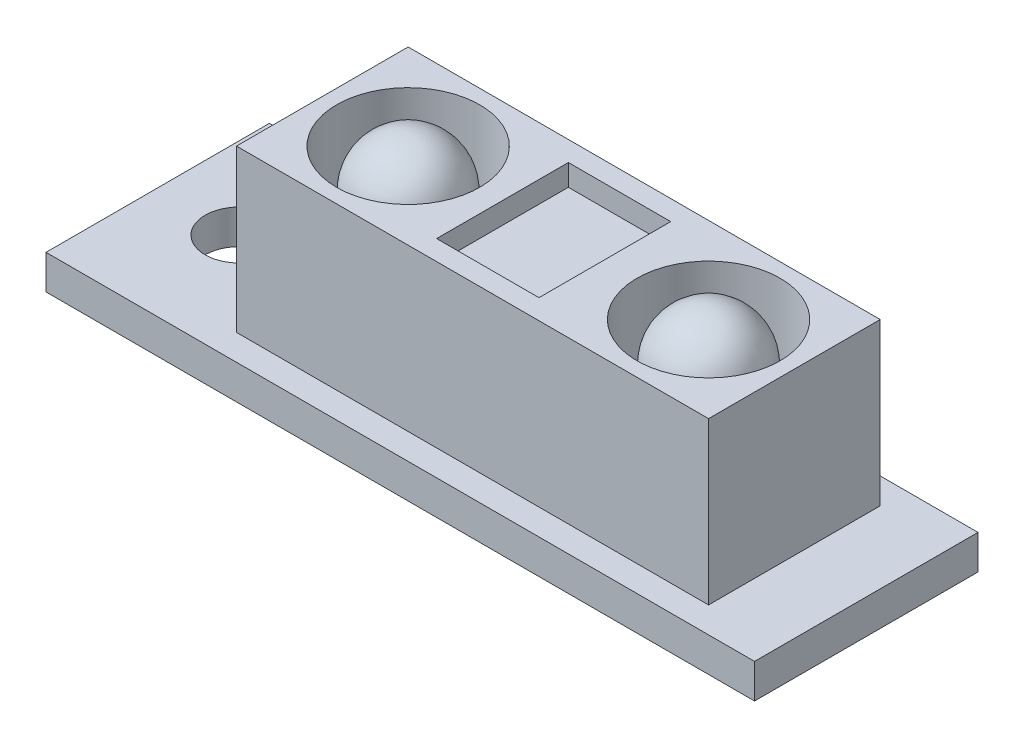
ISO-10303-21;
HEADER;
FILE_DESCRIPTION(('STEP AP214'),'2;1');
FILE_NAME('part.step','',(''),(''),'','','');
FILE_SCHEMA(('AUTOMOTIVE_DESIGN { 1 0 10303 214 1 1 1 1 }'));
ENDSEC;
DATA;
#1=APPLICATION_CONTEXT('core data for automotive mechanical design processes');
#2=APPLICATION_PROTOCOL_DEFINITION('international standard','automotive_design',2000,#1);
#3=PRODUCT_CONTEXT('',#1,'mechanical');
#4=PRODUCT('Part','Part','',(#3));
#5=PRODUCT_RELATED_PRODUCT_CATEGORY('part','',(#4));
#6=PRODUCT_DEFINITION_FORMATION('','',#4);
#7=PRODUCT_DEFINITION_CONTEXT('part definition',#1,'design');
#8=PRODUCT_DEFINITION('design','',#6,#7);
#9=PRODUCT_DEFINITION_SHAPE('','',#8);
#10=(LENGTH_UNIT() NAMED_UNIT(*) SI_UNIT(.MILLI.,.METRE.));
#11=(NAMED_UNIT(*) PLANE_ANGLE_UNIT() SI_UNIT($,.RADIAN.));
#12=(NAMED_UNIT(*) SI_UNIT($,.STERADIAN.) SOLID_ANGLE_UNIT());
#13=UNCERTAINTY_MEASURE_WITH_UNIT(LENGTH_MEASURE(1.E-05),#10,'distance_accuracy_value','');
#14=(GEOMETRIC_REPRESENTATION_CONTEXT(3) GLOBAL_UNCERTAINTY_ASSIGNED_CONTEXT((#13)) GLOBAL_UNIT_ASSIGNED_CONTEXT((#10,
#11,#12)) REPRESENTATION_CONTEXT('',''));
#15=CARTESIAN_POINT('',(0.,0.,0.));
#16=DIRECTION('',(0.,0.,1.));
#17=DIRECTION('',(1.,0.,0.));
#18=AXIS2_PLACEMENT_3D('',#15,#16,#17);
#19=CARTESIAN_POINT('',(0.,1.6,0.));
#20=DIRECTION('',(0.,1.,0.));
#21=DIRECTION('',(0.,0.,1.));
#22=AXIS2_PLACEMENT_3D('',#19,#20,#21);
#23=PLANE('',#22);
#24=CARTESIAN_POINT('',(-12.7,1.6,0.));
#25=DIRECTION('',(0.,1.,0.));
#26=DIRECTION('',(0.,0.,1.));
#27=AXIS2_PLACEMENT_3D('',#24,#25,#26);
#28=CIRCLE('',#27,1.6);
#29=CARTESIAN_POINT('',(-12.7,1.6,1.6));
#30=VERTEX_POINT('',#29);
#31=EDGE_CURVE('E213',#30,#30,#28,.T.);
#32=ORIENTED_EDGE('',*,*,#31,.F.);
#33=EDGE_LOOP('',(#32));
#34=FACE_BOUND('',#33,.T.);
#35=DIRECTION('',(0.,0.,-1.));
#36=VECTOR('',#35,1.);
#37=CARTESIAN_POINT('',(16.51,1.6,-5.207));
#38=LINE('',#37,#36);
#39=CARTESIAN_POINT('',(16.51,1.6,5.207));
#40=VERTEX_POINT('',#39);
#41=CARTESIAN_POINT('',(16.51,1.6,-5.207));
#42=VERTEX_POINT('',#41);
#43=EDGE_CURVE('E220',#40,#42,#38,.T.);
#44=ORIENTED_EDGE('',*,*,#43,.T.);
#45=DIRECTION('',(-1.,0.,0.));
#46=VECTOR('',#45,1.);
#47=CARTESIAN_POINT('',(-16.51,1.6,-5.207));
#48=LINE('',#47,#46);
#49=CARTESIAN_POINT('',(-16.51,1.6,-5.207));
#50=VERTEX_POINT('',#49);
#51=EDGE_CURVE('E223',#42,#50,#48,.T.);
#52=ORIENTED_EDGE('',*,*,#51,.T.);
#53=DIRECTION('',(0.,0.,1.));
#54=VECTOR('',#53,1.);
#55=CARTESIAN_POINT('',(-16.51,1.6,-5.207));
#56=LINE('',#55,#54);
#57=CARTESIAN_POINT('',(-16.51,1.6,5.207));
#58=VERTEX_POINT('',#57);
#59=EDGE_CURVE('E226',#50,#58,#56,.T.);
#60=ORIENTED_EDGE('',*,*,#59,.T.);
#61=DIRECTION('',(1.,0.,0.));
#62=VECTOR('',#61,1.);
#63=CARTESIAN_POINT('',(-16.51,1.6,5.207));
#64=LINE('',#63,#62);
#65=EDGE_CURVE('E228',#58,#40,#64,.T.);
#66=ORIENTED_EDGE('',*,*,#65,.T.);
#67=EDGE_LOOP('',(#44,#52,#60,#66));
#68=FACE_BOUND('',#67,.T.);
#69=DIRECTION('',(1.,0.,0.));
#70=VECTOR('',#69,1.);
#71=CARTESIAN_POINT('',(13.16,1.6,4.));
#72=LINE('',#71,#70);
#73=CARTESIAN_POINT('',(-8.84,1.6,4.));
#74=VERTEX_POINT('',#73);
#75=CARTESIAN_POINT('',(13.16,1.6,4.));
#76=VERTEX_POINT('',#75);
#77=EDGE_CURVE('E200',#74,#76,#72,.T.);
#78=ORIENTED_EDGE('',*,*,#77,.F.);
#79=DIRECTION('',(0.,0.,1.));
#80=VECTOR('',#79,1.);
#81=CARTESIAN_POINT('',(-8.84,1.6,-4.));
#82=LINE('',#81,#80);
#83=CARTESIAN_POINT('',(-8.84,1.6,-4.));
#84=VERTEX_POINT('',#83);
#85=EDGE_CURVE('E184',#84,#74,#82,.T.);
#86=ORIENTED_EDGE('',*,*,#85,.F.);
#87=DIRECTION('',(-1.,0.,0.));
#88=VECTOR('',#87,1.);
#89=CARTESIAN_POINT('',(13.16,1.6,-4.));
#90=LINE('',#89,#88);
#91=CARTESIAN_POINT('',(13.16,1.6,-4.));
#92=VERTEX_POINT('',#91);
#93=EDGE_CURVE('E191',#92,#84,#90,.T.);
#94=ORIENTED_EDGE('',*,*,#93,.F.);
#95=DIRECTION('',(0.,0.,-1.));
#96=VECTOR('',#95,1.);
#97=CARTESIAN_POINT('',(13.16,1.6,-4.));
#98=LINE('',#97,#96);
#99=EDGE_CURVE('E202',#76,#92,#98,.T.);
#100=ORIENTED_EDGE('',*,*,#99,.F.);
#101=EDGE_LOOP('',(#78,#86,#94,#100));
#102=FACE_BOUND('',#101,.T.);
#103=ADVANCED_FACE('F37',(#34,#68,#102),#23,.T.);
#104=CARTESIAN_POINT('',(16.51,1.6,-5.207));
#105=DIRECTION('',(-1.,0.,0.));
#106=DIRECTION('',(0.,0.,1.));
#107=AXIS2_PLACEMENT_3D('',#104,#105,#106);
#108=PLANE('',#107);
#109=DIRECTION('',(0.,0.,-1.));
#110=VECTOR('',#109,1.);
#111=CARTESIAN_POINT('',(16.51,0.,-5.207));
#112=LINE('',#111,#110);
#113=CARTESIAN_POINT('',(16.51,0.,5.207));
#114=VERTEX_POINT('',#113);
#115=CARTESIAN_POINT('',(16.51,0.,-5.207));
#116=VERTEX_POINT('',#115);
#117=EDGE_CURVE('E217',#114,#116,#112,.T.);
#118=ORIENTED_EDGE('',*,*,#117,.T.);
#119=DIRECTION('',(0.,-1.,0.));
#120=VECTOR('',#119,1.);
#121=CARTESIAN_POINT('',(16.51,1.6,-5.207));
#122=LINE('',#121,#120);
#123=EDGE_CURVE('E11',#42,#116,#122,.T.);
#124=ORIENTED_EDGE('',*,*,#123,.F.);
#125=ORIENTED_EDGE('',*,*,#43,.F.);
#126=DIRECTION('',(0.,-1.,0.));
#127=VECTOR('',#126,1.);
#128=CARTESIAN_POINT('',(16.51,1.6,5.207));
#129=LINE('',#128,#127);
#130=EDGE_CURVE('E230',#40,#114,#129,.T.);
#131=ORIENTED_EDGE('',*,*,#130,.T.);
#132=EDGE_LOOP('',(#118,#124,#125,#131));
#133=FACE_BOUND('',#132,.T.);
#134=ADVANCED_FACE('F292',(#133),#108,.F.);
#135=CARTESIAN_POINT('',(-16.51,1.6,-5.207));
#136=DIRECTION('',(0.,0.,1.));
#137=DIRECTION('',(1.,0.,0.));
#138=AXIS2_PLACEMENT_3D('',#135,#136,#137);
#139=PLANE('',#138);
#140=DIRECTION('',(-1.,0.,0.));
#141=VECTOR('',#140,1.);
#142=CARTESIAN_POINT('',(-16.51,0.,-5.207));
#143=LINE('',#142,#141);
#144=CARTESIAN_POINT('',(-16.51,0.,-5.207));
#145=VERTEX_POINT('',#144);
#146=EDGE_CURVE('E233',#116,#145,#143,.T.);
#147=ORIENTED_EDGE('',*,*,#146,.T.);
#148=DIRECTION('',(0.,-1.,0.));
#149=VECTOR('',#148,1.);
#150=CARTESIAN_POINT('',(-16.51,1.6,-5.207));
#151=LINE('',#150,#149);
#152=EDGE_CURVE('E46',#50,#145,#151,.T.);
#153=ORIENTED_EDGE('',*,*,#152,.F.);
#154=ORIENTED_EDGE('',*,*,#51,.F.);
#155=ORIENTED_EDGE('',*,*,#123,.T.);
#156=EDGE_LOOP('',(#147,#153,#154,#155));
#157=FACE_BOUND('',#156,.T.);
#158=ADVANCED_FACE('F298',(#157),#139,.F.);
#159=CARTESIAN_POINT('',(-16.51,1.6,-5.207));
#160=DIRECTION('',(1.,0.,0.));
#161=DIRECTION('',(0.,0.,-1.));
#162=AXIS2_PLACEMENT_3D('',#159,#160,#161);
#163=PLANE('',#162);
#164=DIRECTION('',(0.,0.,1.));
#165=VECTOR('',#164,1.);
#166=CARTESIAN_POINT('',(-16.51,0.,-5.207));
#167=LINE('',#166,#165);
#168=CARTESIAN_POINT('',(-16.51,0.,5.207));
#169=VERTEX_POINT('',#168);
#170=EDGE_CURVE('E235',#145,#169,#167,.T.);
#171=ORIENTED_EDGE('',*,*,#170,.T.);
#172=DIRECTION('',(0.,-1.,0.));
#173=VECTOR('',#172,1.);
#174=CARTESIAN_POINT('',(-16.51,1.6,5.207));
#175=LINE('',#174,#173);
#176=EDGE_CURVE('E240',#58,#169,#175,.T.);
#177=ORIENTED_EDGE('',*,*,#176,.F.);
#178=ORIENTED_EDGE('',*,*,#59,.F.);
#179=ORIENTED_EDGE('',*,*,#152,.T.);
#180=EDGE_LOOP('',(#171,#177,#178,#179));
#181=FACE_BOUND('',#180,.T.);
#182=ADVANCED_FACE('F314',(#181),#163,.F.);
#183=CARTESIAN_POINT('',(-16.51,1.6,5.207));
#184=DIRECTION('',(0.,0.,-1.));
#185=DIRECTION('',(-1.,0.,0.));
#186=AXIS2_PLACEMENT_3D('',#183,#184,#185);
#187=PLANE('',#186);
#188=DIRECTION('',(1.,0.,0.));
#189=VECTOR('',#188,1.);
#190=CARTESIAN_POINT('',(-16.51,0.,5.207));
#191=LINE('',#190,#189);
#192=EDGE_CURVE('E224',#169,#114,#191,.T.);
#193=ORIENTED_EDGE('',*,*,#192,.T.);
#194=ORIENTED_EDGE('',*,*,#130,.F.);
#195=ORIENTED_EDGE('',*,*,#65,.F.);
#196=ORIENTED_EDGE('',*,*,#176,.T.);
#197=EDGE_LOOP('',(#193,#194,#195,#196));
#198=FACE_BOUND('',#197,.T.);
#199=ADVANCED_FACE('F310',(#198),#187,.F.);
#200=CARTESIAN_POINT('',(0.,0.,0.));
#201=DIRECTION('',(0.,1.,0.));
#202=DIRECTION('',(0.,0.,1.));
#203=AXIS2_PLACEMENT_3D('',#200,#201,#202);
#204=PLANE('',#203);
#205=CARTESIAN_POINT('',(-12.7,0.,0.));
#206=DIRECTION('',(0.,1.,0.));
#207=DIRECTION('',(0.,0.,1.));
#208=AXIS2_PLACEMENT_3D('',#205,#206,#207);
#209=CIRCLE('',#208,1.6);
#210=CARTESIAN_POINT('',(-12.7,0.,1.6));
#211=VERTEX_POINT('',#210);
#212=EDGE_CURVE('E214',#211,#211,#209,.T.);
#213=ORIENTED_EDGE('',*,*,#212,.T.);
#214=EDGE_LOOP('',(#213));
#215=FACE_BOUND('',#214,.T.);
#216=ORIENTED_EDGE('',*,*,#117,.F.);
#217=ORIENTED_EDGE('',*,*,#192,.F.);
#218=ORIENTED_EDGE('',*,*,#170,.F.);
#219=ORIENTED_EDGE('',*,*,#146,.F.);
#220=EDGE_LOOP('',(#216,#217,#218,#219));
#221=FACE_BOUND('',#220,.T.);
#222=ADVANCED_FACE('F307',(#215,#221),#204,.F.);
#223=CARTESIAN_POINT('',(-12.7,0.,0.));
#224=DIRECTION('',(0.,1.,0.));
#225=DIRECTION('',(0.,0.,1.));
#226=AXIS2_PLACEMENT_3D('',#223,#224,#225);
#227=CYLINDRICAL_SURFACE('',#226,1.6);
#228=ORIENTED_EDGE('',*,*,#212,.F.);
#229=EDGE_LOOP('',(#228));
#230=FACE_BOUND('',#229,.T.);
#231=ORIENTED_EDGE('',*,*,#31,.T.);
#232=EDGE_LOOP('',(#231));
#233=FACE_BOUND('',#232,.T.);
#234=ADVANCED_FACE('F305',(#230,#233),#227,.F.);
#235=CARTESIAN_POINT('',(-8.84,9.12,-4.));
#236=DIRECTION('',(1.,0.,0.));
#237=DIRECTION('',(0.,0.,-1.));
#238=AXIS2_PLACEMENT_3D('',#235,#236,#237);
#239=PLANE('',#238);
#240=ORIENTED_EDGE('',*,*,#85,.T.);
#241=DIRECTION('',(0.,-1.,0.));
#242=VECTOR('',#241,1.);
#243=CARTESIAN_POINT('',(-8.84,9.12,4.));
#244=LINE('',#243,#242);
#245=CARTESIAN_POINT('',(-8.84,9.12,4.));
#246=VERTEX_POINT('',#245);
#247=EDGE_CURVE('E211',#246,#74,#244,.T.);
#248=ORIENTED_EDGE('',*,*,#247,.F.);
#249=DIRECTION('',(0.,0.,1.));
#250=VECTOR('',#249,1.);
#251=CARTESIAN_POINT('',(-8.84,9.12,-4.));
#252=LINE('',#251,#250);
#253=CARTESIAN_POINT('',(-8.84,9.12,-4.));
#254=VERTEX_POINT('',#253);
#255=EDGE_CURVE('E187',#254,#246,#252,.T.);
#256=ORIENTED_EDGE('',*,*,#255,.F.);
#257=DIRECTION('',(0.,-1.,0.));
#258=VECTOR('',#257,1.);
#259=CARTESIAN_POINT('',(-8.84,9.12,-4.));
#260=LINE('',#259,#258);
#261=EDGE_CURVE('E197',#254,#84,#260,.T.);
#262=ORIENTED_EDGE('',*,*,#261,.T.);
#263=EDGE_LOOP('',(#240,#248,#256,#262));
#264=FACE_BOUND('',#263,.T.);
#265=ADVANCED_FACE('F280',(#264),#239,.F.);
#266=CARTESIAN_POINT('',(13.16,9.12,4.));
#267=DIRECTION('',(0.,0.,-1.));
#268=DIRECTION('',(-1.,0.,0.));
#269=AXIS2_PLACEMENT_3D('',#266,#267,#268);
#270=PLANE('',#269);
#271=ORIENTED_EDGE('',*,*,#77,.T.);
#272=DIRECTION('',(0.,-1.,0.));
#273=VECTOR('',#272,1.);
#274=CARTESIAN_POINT('',(13.16,9.12,4.));
#275=LINE('',#274,#273);
#276=CARTESIAN_POINT('',(13.16,9.12,4.));
#277=VERTEX_POINT('',#276);
#278=EDGE_CURVE('E208',#277,#76,#275,.T.);
#279=ORIENTED_EDGE('',*,*,#278,.F.);
#280=DIRECTION('',(1.,0.,0.));
#281=VECTOR('',#280,1.);
#282=CARTESIAN_POINT('',(13.16,9.12,4.));
#283=LINE('',#282,#281);
#284=EDGE_CURVE('E190',#246,#277,#283,.T.);
#285=ORIENTED_EDGE('',*,*,#284,.F.);
#286=ORIENTED_EDGE('',*,*,#247,.T.);
#287=EDGE_LOOP('',(#271,#279,#285,#286));
#288=FACE_BOUND('',#287,.T.);
#289=ADVANCED_FACE('F284',(#288),#270,.F.);
#290=CARTESIAN_POINT('',(13.16,9.12,-4.));
#291=DIRECTION('',(-1.,0.,0.));
#292=DIRECTION('',(0.,0.,1.));
#293=AXIS2_PLACEMENT_3D('',#290,#291,#292);
#294=PLANE('',#293);
#295=ORIENTED_EDGE('',*,*,#99,.T.);
#296=DIRECTION('',(0.,-1.,0.));
#297=VECTOR('',#296,1.);
#298=CARTESIAN_POINT('',(13.16,9.12,-4.));
#299=LINE('',#298,#297);
#300=CARTESIAN_POINT('',(13.16,9.12,-4.));
#301=VERTEX_POINT('',#300);
#302=EDGE_CURVE('E62',#301,#92,#299,.T.);
#303=ORIENTED_EDGE('',*,*,#302,.F.);
#304=DIRECTION('',(0.,0.,-1.));
#305=VECTOR('',#304,1.);
#306=CARTESIAN_POINT('',(13.16,9.12,-4.));
#307=LINE('',#306,#305);
#308=EDGE_CURVE('E193',#277,#301,#307,.T.);
#309=ORIENTED_EDGE('',*,*,#308,.F.);
#310=ORIENTED_EDGE('',*,*,#278,.T.);
#311=EDGE_LOOP('',(#295,#303,#309,#310));
#312=FACE_BOUND('',#311,.T.);
#313=ADVANCED_FACE('F288',(#312),#294,.F.);
#314=CARTESIAN_POINT('',(13.16,9.12,-4.));
#315=DIRECTION('',(0.,0.,1.));
#316=DIRECTION('',(1.,0.,0.));
#317=AXIS2_PLACEMENT_3D('',#314,#315,#316);
#318=PLANE('',#317);
#319=ORIENTED_EDGE('',*,*,#93,.T.);
#320=ORIENTED_EDGE('',*,*,#261,.F.);
#321=DIRECTION('',(-1.,0.,0.));
#322=VECTOR('',#321,1.);
#323=CARTESIAN_POINT('',(13.16,9.12,-4.));
#324=LINE('',#323,#322);
#325=EDGE_CURVE('E195',#301,#254,#324,.T.);
#326=ORIENTED_EDGE('',*,*,#325,.F.);
#327=ORIENTED_EDGE('',*,*,#302,.T.);
#328=EDGE_LOOP('',(#319,#320,#326,#327));
#329=FACE_BOUND('',#328,.T.);
#330=ADVANCED_FACE('F272',(#329),#318,.F.);
#331=CARTESIAN_POINT('',(0.,9.12,0.));
#332=DIRECTION('',(0.,-1.,0.));
#333=DIRECTION('',(0.,0.,-1.));
#334=AXIS2_PLACEMENT_3D('',#331,#332,#333);
#335=PLANE('',#334);
#336=DIRECTION('',(1.,0.,0.));
#337=VECTOR('',#336,1.);
#338=CARTESIAN_POINT('',(4.32722089106688,9.12,3.06999995600001));
#339=LINE('',#338,#337);
#340=CARTESIAN_POINT('',(-0.442779108933119,9.12,3.06999995600001));
#341=VERTEX_POINT('',#340);
#342=CARTESIAN_POINT('',(4.32722089106688,9.12,3.06999995600001));
#343=VERTEX_POINT('',#342);
#344=EDGE_CURVE('E158',#341,#343,#339,.T.);
#345=ORIENTED_EDGE('',*,*,#344,.F.);
#346=DIRECTION('',(0.,0.,1.));
#347=VECTOR('',#346,1.);
#348=CARTESIAN_POINT('',(-0.442779108933119,9.12,3.06999995600001));
#349=LINE('',#348,#347);
#350=CARTESIAN_POINT('',(-0.442779108933119,9.12,-3.06999995599999));
#351=VERTEX_POINT('',#350);
#352=EDGE_CURVE('E54',#351,#341,#349,.T.);
#353=ORIENTED_EDGE('',*,*,#352,.F.);
#354=DIRECTION('',(-1.,0.,0.));
#355=VECTOR('',#354,1.);
#356=CARTESIAN_POINT('',(4.32722089106688,9.12,-3.06999995599999));
#357=LINE('',#356,#355);
#358=CARTESIAN_POINT('',(4.32722089106688,9.12,-3.06999995599999));
#359=VERTEX_POINT('',#358);
#360=EDGE_CURVE('E149',#359,#351,#357,.T.);
#361=ORIENTED_EDGE('',*,*,#360,.F.);
#362=DIRECTION('',(0.,0.,-1.));
#363=VECTOR('',#362,1.);
#364=CARTESIAN_POINT('',(4.32722089106688,9.12,3.06999995600001));
#365=LINE('',#364,#363);
#366=EDGE_CURVE('E152',#343,#359,#365,.T.);
#367=ORIENTED_EDGE('',*,*,#366,.F.);
#368=EDGE_LOOP('',(#345,#353,#361,#367));
#369=FACE_BOUND('',#368,.T.);
#370=CARTESIAN_POINT('',(9.16,9.12,0.));
#371=DIRECTION('',(0.,1.,0.));
#372=DIRECTION('',(0.,0.,-1.));
#373=AXIS2_PLACEMENT_3D('',#370,#371,#372);
#374=CIRCLE('',#373,3.335);
#375=CARTESIAN_POINT('',(9.16,9.12,-3.335));
#376=VERTEX_POINT('',#375);
#377=EDGE_CURVE('E178',#376,#376,#374,.T.);
#378=ORIENTED_EDGE('',*,*,#377,.F.);
#379=EDGE_LOOP('',(#378));
#380=FACE_BOUND('',#379,.T.);
#381=CARTESIAN_POINT('',(-4.84,9.12,0.));
#382=DIRECTION('',(0.,1.,0.));
#383=DIRECTION('',(0.,0.,1.));
#384=AXIS2_PLACEMENT_3D('',#381,#382,#383);
#385=CIRCLE('',#384,3.335);
#386=CARTESIAN_POINT('',(-4.84,9.12,3.335));
#387=VERTEX_POINT('',#386);
#388=EDGE_CURVE('E177',#387,#387,#385,.T.);
#389=ORIENTED_EDGE('',*,*,#388,.F.);
#390=EDGE_LOOP('',(#389));
#391=FACE_BOUND('',#390,.T.);
#392=ORIENTED_EDGE('',*,*,#255,.T.);
#393=ORIENTED_EDGE('',*,*,#284,.T.);
#394=ORIENTED_EDGE('',*,*,#308,.T.);
#395=ORIENTED_EDGE('',*,*,#325,.T.);
#396=EDGE_LOOP('',(#392,#393,#394,#395));
#397=FACE_BOUND('',#396,.T.);
#398=ADVANCED_FACE('F266',(#369,#380,#391,#397),#335,.F.);
#399=CARTESIAN_POINT('',(-4.84,4.12,0.));
#400=DIRECTION('',(0.,1.,0.));
#401=DIRECTION('',(0.,0.,1.));
#402=AXIS2_PLACEMENT_3D('',#399,#400,#401);
#403=CYLINDRICAL_SURFACE('',#402,3.335);
#404=CARTESIAN_POINT('',(-4.84,4.12,0.));
#405=DIRECTION('',(0.,1.,0.));
#406=DIRECTION('',(0.,0.,1.));
#407=AXIS2_PLACEMENT_3D('',#404,#405,#406);
#408=CIRCLE('',#407,3.335);
#409=CARTESIAN_POINT('',(-4.84,4.12,3.335));
#410=VERTEX_POINT('',#409);
#411=EDGE_CURVE('E181',#410,#410,#408,.T.);
#412=ORIENTED_EDGE('',*,*,#411,.F.);
#413=EDGE_LOOP('',(#412));
#414=FACE_BOUND('',#413,.T.);
#415=ORIENTED_EDGE('',*,*,#388,.T.);
#416=EDGE_LOOP('',(#415));
#417=FACE_BOUND('',#416,.T.);
#418=ADVANCED_FACE('F260',(#414,#417),#403,.F.);
#419=CARTESIAN_POINT('',(-4.84,4.12,0.));
#420=DIRECTION('',(0.,1.,0.));
#421=DIRECTION('',(0.,0.,1.));
#422=AXIS2_PLACEMENT_3D('',#419,#420,#421);
#423=PLANE('',#422);
#424=CARTESIAN_POINT('',(-4.84,4.12,0.));
#425=DIRECTION('',(0.,1.,0.));
#426=DIRECTION('',(0.,0.,1.));
#427=AXIS2_PLACEMENT_3D('',#424,#425,#426);
#428=CIRCLE('',#427,2.334999968);
#429=CARTESIAN_POINT('',(-4.84,4.12,2.334999968));
#430=VERTEX_POINT('',#429);
#431=EDGE_CURVE('E170',#430,#430,#428,.T.);
#432=ORIENTED_EDGE('',*,*,#431,.F.);
#433=EDGE_LOOP('',(#432));
#434=FACE_BOUND('',#433,.T.);
#435=ORIENTED_EDGE('',*,*,#411,.T.);
#436=EDGE_LOOP('',(#435));
#437=FACE_BOUND('',#436,.T.);
#438=ADVANCED_FACE('F256',(#434,#437),#423,.T.);
#439=CARTESIAN_POINT('',(9.16,4.12,0.));
#440=DIRECTION('',(0.,1.,0.));
#441=DIRECTION('',(0.,0.,1.));
#442=AXIS2_PLACEMENT_3D('',#439,#440,#441);
#443=CYLINDRICAL_SURFACE('',#442,3.335);
#444=CARTESIAN_POINT('',(9.16,4.12,0.));
#445=DIRECTION('',(0.,1.,0.));
#446=DIRECTION('',(0.,0.,-1.));
#447=AXIS2_PLACEMENT_3D('',#444,#445,#446);
#448=CIRCLE('',#447,3.335);
#449=CARTESIAN_POINT('',(9.16,4.12,-3.335));
#450=VERTEX_POINT('',#449);
#451=EDGE_CURVE('E174',#450,#450,#448,.T.);
#452=ORIENTED_EDGE('',*,*,#451,.F.);
#453=EDGE_LOOP('',(#452));
#454=FACE_BOUND('',#453,.T.);
#455=ORIENTED_EDGE('',*,*,#377,.T.);
#456=EDGE_LOOP('',(#455));
#457=FACE_BOUND('',#456,.T.);
#458=ADVANCED_FACE('F259',(#454,#457),#443,.F.);
#459=CARTESIAN_POINT('',(9.16,4.12,0.));
#460=DIRECTION('',(0.,-1.,0.));
#461=DIRECTION('',(0.,0.,-1.));
#462=AXIS2_PLACEMENT_3D('',#459,#460,#461);
#463=PLANE('',#462);
#464=CARTESIAN_POINT('',(9.16,4.12,0.));
#465=DIRECTION('',(0.,-1.,0.));
#466=DIRECTION('',(0.,0.,1.));
#467=AXIS2_PLACEMENT_3D('',#464,#465,#466);
#468=CIRCLE('',#467,2.334999968);
#469=CARTESIAN_POINT('',(9.16,4.12,2.334999968));
#470=VERTEX_POINT('',#469);
#471=EDGE_CURVE('E164',#470,#470,#468,.T.);
#472=ORIENTED_EDGE('',*,*,#471,.T.);
#473=EDGE_LOOP('',(#472));
#474=FACE_BOUND('',#473,.T.);
#475=ORIENTED_EDGE('',*,*,#451,.T.);
#476=EDGE_LOOP('',(#475));
#477=FACE_BOUND('',#476,.T.);
#478=ADVANCED_FACE('F252',(#474,#477),#463,.F.);
#479=CARTESIAN_POINT('',(-4.84,7.12,0.));
#480=DIRECTION('',(0.,-1.,0.));
#481=DIRECTION('',(0.,0.,-1.));
#482=AXIS2_PLACEMENT_3D('',#479,#480,#481);
#483=CYLINDRICAL_SURFACE('',#482,2.334999968);
#484=CARTESIAN_POINT('',(-4.84,7.12,0.));
#485=DIRECTION('',(0.,1.,0.));
#486=DIRECTION('',(0.,0.,1.));
#487=AXIS2_PLACEMENT_3D('',#484,#485,#486);
#488=CIRCLE('',#487,2.334999968);
#489=CARTESIAN_POINT('',(-4.84,7.12,2.334999968));
#490=VERTEX_POINT('',#489);
#491=EDGE_CURVE('E173',#490,#490,#488,.T.);
#492=ORIENTED_EDGE('',*,*,#491,.F.);
#493=EDGE_LOOP('',(#492));
#494=FACE_BOUND('',#493,.T.);
#495=ORIENTED_EDGE('',*,*,#431,.T.);
#496=EDGE_LOOP('',(#495));
#497=FACE_BOUND('',#496,.T.);
#498=ADVANCED_FACE('F249',(#494,#497),#483,.T.);
#499=CARTESIAN_POINT('',(-4.84,7.31672739162205,0.));
#500=DIRECTION('',(0.,0.,1.));
#501=DIRECTION('',(1.,0.,0.));
#502=AXIS2_PLACEMENT_3D('',#499,#500,#501);
#503=SPHERICAL_SURFACE('',#502,2.34327260837795);
#504=CARTESIAN_POINT('',(-4.84,7.31672739162205,0.));
#505=DIRECTION('',(0.,1.,0.));
#506=DIRECTION('',(0.,0.,1.));
#507=AXIS2_PLACEMENT_3D('',#504,#505,#506);
#508=SPHERICAL_SURFACE('',#507,2.34327260837795);
#509=ORIENTED_EDGE('',*,*,#491,.T.);
#510=EDGE_LOOP('',(#509));
#511=FACE_BOUND('',#510,.T.);
#512=ADVANCED_FACE('F247',(#511),#508,.T.);
#513=CARTESIAN_POINT('',(9.16,7.12,0.));
#514=DIRECTION('',(0.,-1.,0.));
#515=DIRECTION('',(0.,0.,-1.));
#516=AXIS2_PLACEMENT_3D('',#513,#514,#515);
#517=CYLINDRICAL_SURFACE('',#516,2.334999968);
#518=CARTESIAN_POINT('',(9.16,7.12,0.));
#519=DIRECTION('',(0.,-1.,0.));
#520=DIRECTION('',(0.,0.,1.));
#521=AXIS2_PLACEMENT_3D('',#518,#519,#520);
#522=CIRCLE('',#521,2.334999968);
#523=CARTESIAN_POINT('',(9.16,7.12,2.334999968));
#524=VERTEX_POINT('',#523);
#525=EDGE_CURVE('E41',#524,#524,#522,.T.);
#526=ORIENTED_EDGE('',*,*,#525,.T.);
#527=EDGE_LOOP('',(#526));
#528=FACE_BOUND('',#527,.T.);
#529=ORIENTED_EDGE('',*,*,#471,.F.);
#530=EDGE_LOOP('',(#529));
#531=FACE_BOUND('',#530,.T.);
#532=ADVANCED_FACE('F322',(#528,#531),#517,.T.);
#533=CARTESIAN_POINT('',(9.16,7.31672739162205,0.));
#534=DIRECTION('',(0.,0.,1.));
#535=DIRECTION('',(1.,0.,0.));
#536=AXIS2_PLACEMENT_3D('',#533,#534,#535);
#537=SPHERICAL_SURFACE('',#536,2.34327260837795);
#538=CARTESIAN_POINT('',(9.16,7.31672739162205,0.));
#539=DIRECTION('',(0.,-1.,0.));
#540=DIRECTION('',(0.,0.,1.));
#541=AXIS2_PLACEMENT_3D('',#538,#539,#540);
#542=SPHERICAL_SURFACE('',#541,2.34327260837795);
#543=ORIENTED_EDGE('',*,*,#525,.F.);
#544=EDGE_LOOP('',(#543));
#545=FACE_BOUND('',#544,.T.);
#546=ADVANCED_FACE('F39',(#545),#542,.T.);
#547=CARTESIAN_POINT('',(-0.442779108933119,8.12,3.06999995600001));
#548=DIRECTION('',(-1.,0.,0.));
#549=DIRECTION('',(0.,0.,1.));
#550=AXIS2_PLACEMENT_3D('',#547,#548,#549);
#551=PLANE('',#550);
#552=ORIENTED_EDGE('',*,*,#352,.T.);
#553=DIRECTION('',(0.,1.,0.));
#554=VECTOR('',#553,1.);
#555=CARTESIAN_POINT('',(-0.442779108933119,8.12,3.06999995600001));
#556=LINE('',#555,#554);
#557=CARTESIAN_POINT('',(-0.442779108933119,8.12,3.06999995600001));
#558=VERTEX_POINT('',#557);
#559=EDGE_CURVE('E127',#558,#341,#556,.T.);
#560=ORIENTED_EDGE('',*,*,#559,.F.);
#561=DIRECTION('',(0.,0.,1.));
#562=VECTOR('',#561,1.);
#563=CARTESIAN_POINT('',(-0.442779108933119,8.12,3.06999995600001));
#564=LINE('',#563,#562);
#565=CARTESIAN_POINT('',(-0.442779108933119,8.12,-3.06999995599999));
#566=VERTEX_POINT('',#565);
#567=EDGE_CURVE('E131',#566,#558,#564,.T.);
#568=ORIENTED_EDGE('',*,*,#567,.F.);
#569=DIRECTION('',(0.,1.,0.));
#570=VECTOR('',#569,1.);
#571=CARTESIAN_POINT('',(-0.442779108933119,8.12,-3.06999995599999));
#572=LINE('',#571,#570);
#573=EDGE_CURVE('E162',#566,#351,#572,.T.);
#574=ORIENTED_EDGE('',*,*,#573,.T.);
#575=EDGE_LOOP('',(#552,#560,#568,#574));
#576=FACE_BOUND('',#575,.T.);
#577=ADVANCED_FACE('F129',(#576),#551,.F.);
#578=CARTESIAN_POINT('',(4.32722089106688,8.12,-3.06999995599999));
#579=DIRECTION('',(0.,0.,-1.));
#580=DIRECTION('',(-1.,0.,0.));
#581=AXIS2_PLACEMENT_3D('',#578,#579,#580);
#582=PLANE('',#581);
#583=ORIENTED_EDGE('',*,*,#360,.T.);
#584=ORIENTED_EDGE('',*,*,#573,.F.);
#585=DIRECTION('',(-1.,0.,0.));
#586=VECTOR('',#585,1.);
#587=CARTESIAN_POINT('',(4.32722089106688,8.12,-3.06999995599999));
#588=LINE('',#587,#586);
#589=CARTESIAN_POINT('',(4.32722089106688,8.12,-3.06999995599999));
#590=VERTEX_POINT('',#589);
#591=EDGE_CURVE('E137',#590,#566,#588,.T.);
#592=ORIENTED_EDGE('',*,*,#591,.F.);
#593=DIRECTION('',(0.,1.,0.));
#594=VECTOR('',#593,1.);
#595=CARTESIAN_POINT('',(4.32722089106688,8.12,-3.06999995599999));
#596=LINE('',#595,#594);
#597=EDGE_CURVE('E165',#590,#359,#596,.T.);
#598=ORIENTED_EDGE('',*,*,#597,.T.);
#599=EDGE_LOOP('',(#583,#584,#592,#598));
#600=FACE_BOUND('',#599,.T.);
#601=ADVANCED_FACE('F474',(#600),#582,.F.);
#602=CARTESIAN_POINT('',(4.32722089106688,8.12,3.06999995600001));
#603=DIRECTION('',(1.,0.,0.));
#604=DIRECTION('',(0.,0.,-1.));
#605=AXIS2_PLACEMENT_3D('',#602,#603,#604);
#606=PLANE('',#605);
#607=ORIENTED_EDGE('',*,*,#366,.T.);
#608=ORIENTED_EDGE('',*,*,#597,.F.);
#609=DIRECTION('',(0.,0.,-1.));
#610=VECTOR('',#609,1.);
#611=CARTESIAN_POINT('',(4.32722089106688,8.12,3.06999995600001));
#612=LINE('',#611,#610);
#613=CARTESIAN_POINT('',(4.32722089106688,8.12,3.06999995600001));
#614=VERTEX_POINT('',#613);
#615=EDGE_CURVE('E145',#614,#590,#612,.T.);
#616=ORIENTED_EDGE('',*,*,#615,.F.);
#617=DIRECTION('',(0.,1.,0.));
#618=VECTOR('',#617,1.);
#619=CARTESIAN_POINT('',(4.32722089106688,8.12,3.06999995600001));
#620=LINE('',#619,#618);
#621=EDGE_CURVE('E136',#614,#343,#620,.T.);
#622=ORIENTED_EDGE('',*,*,#621,.T.);
#623=EDGE_LOOP('',(#607,#608,#616,#622));
#624=FACE_BOUND('',#623,.T.);
#625=ADVANCED_FACE('F481',(#624),#606,.F.);
#626=CARTESIAN_POINT('',(4.32722089106688,8.12,3.06999995600001));
#627=DIRECTION('',(0.,0.,1.));
#628=DIRECTION('',(1.,0.,0.));
#629=AXIS2_PLACEMENT_3D('',#626,#627,#628);
#630=PLANE('',#629);
#631=ORIENTED_EDGE('',*,*,#344,.T.);
#632=ORIENTED_EDGE('',*,*,#621,.F.);
#633=DIRECTION('',(1.,0.,0.));
#634=VECTOR('',#633,1.);
#635=CARTESIAN_POINT('',(4.32722089106688,8.12,3.06999995600001));
#636=LINE('',#635,#634);
#637=EDGE_CURVE('E140',#558,#614,#636,.T.);
#638=ORIENTED_EDGE('',*,*,#637,.F.);
#639=ORIENTED_EDGE('',*,*,#559,.T.);
#640=EDGE_LOOP('',(#631,#632,#638,#639));
#641=FACE_BOUND('',#640,.T.);
#642=ADVANCED_FACE('F141',(#641),#630,.F.);
#643=CARTESIAN_POINT('',(0.,8.12,0.));
#644=DIRECTION('',(0.,1.,0.));
#645=DIRECTION('',(0.,0.,1.));
#646=AXIS2_PLACEMENT_3D('',#643,#644,#645);
#647=PLANE('',#646);
#648=ORIENTED_EDGE('',*,*,#567,.T.);
#649=ORIENTED_EDGE('',*,*,#637,.T.);
#650=ORIENTED_EDGE('',*,*,#615,.T.);
#651=ORIENTED_EDGE('',*,*,#591,.T.);
#652=EDGE_LOOP('',(#648,#649,#650,#651));
#653=FACE_BOUND('',#652,.T.);
#654=ADVANCED_FACE('F147',(#653),#647,.T.);
#655=CLOSED_SHELL('',(#103,#134,#158,#182,#199,#222,#234,#265,#289,#313,#330,#398,#418,#438,
#458,#478,#498,#512,#532,#546,#577,#601,#625,#642,#654));
#656=MANIFOLD_SOLID_BREP('B2',#655);
#657=ADVANCED_BREP_SHAPE_REPRESENTATION('',(#18,#656),#14);
#658=SHAPE_DEFINITION_REPRESENTATION(#9,#657);
ENDSEC;
END-ISO-10303-21;
